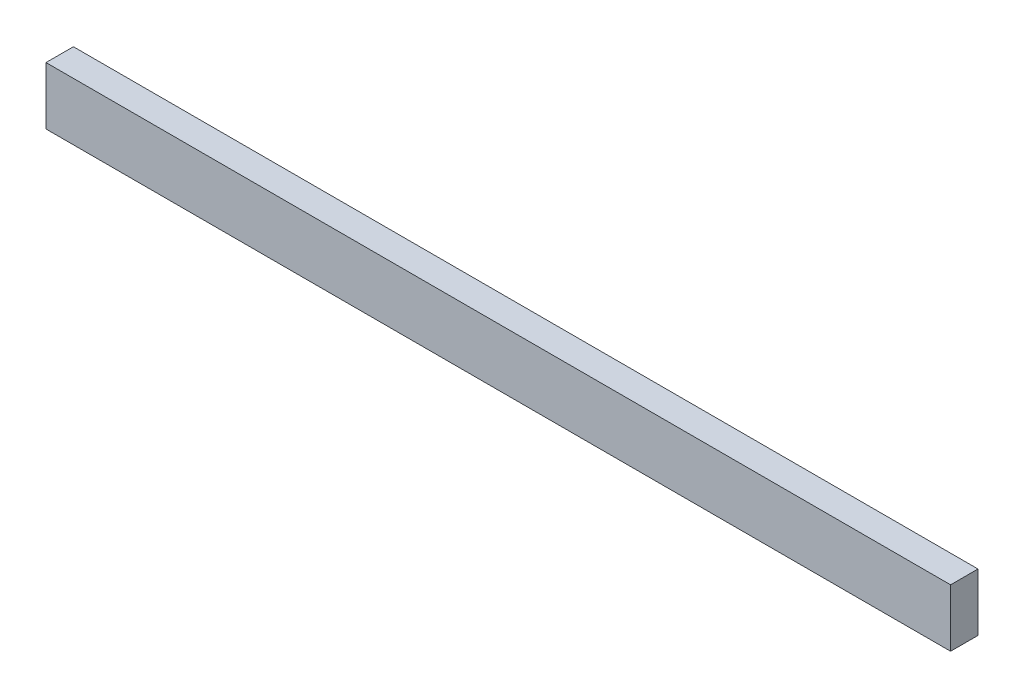
ISO-10303-21;
HEADER;
FILE_DESCRIPTION(('STEP AP214'),'2;1');
FILE_NAME('part.step','',(''),(''),'','','');
FILE_SCHEMA(('AUTOMOTIVE_DESIGN { 1 0 10303 214 1 1 1 1 }'));
ENDSEC;
DATA;
#1=APPLICATION_CONTEXT('core data for automotive mechanical design processes');
#2=APPLICATION_PROTOCOL_DEFINITION('international standard','automotive_design',2000,#1);
#3=PRODUCT_CONTEXT('',#1,'mechanical');
#4=PRODUCT('Part','Part','',(#3));
#5=PRODUCT_RELATED_PRODUCT_CATEGORY('part','',(#4));
#6=PRODUCT_DEFINITION_FORMATION('','',#4);
#7=PRODUCT_DEFINITION_CONTEXT('part definition',#1,'design');
#8=PRODUCT_DEFINITION('design','',#6,#7);
#9=PRODUCT_DEFINITION_SHAPE('','',#8);
#10=(LENGTH_UNIT() NAMED_UNIT(*) SI_UNIT(.MILLI.,.METRE.));
#11=(NAMED_UNIT(*) PLANE_ANGLE_UNIT() SI_UNIT($,.RADIAN.));
#12=(NAMED_UNIT(*) SI_UNIT($,.STERADIAN.) SOLID_ANGLE_UNIT());
#13=UNCERTAINTY_MEASURE_WITH_UNIT(LENGTH_MEASURE(1.E-05),#10,'distance_accuracy_value','');
#14=(GEOMETRIC_REPRESENTATION_CONTEXT(3) GLOBAL_UNCERTAINTY_ASSIGNED_CONTEXT((#13)) GLOBAL_UNIT_ASSIGNED_CONTEXT((#10,
#11,#12)) REPRESENTATION_CONTEXT('',''));
#15=CARTESIAN_POINT('',(0.,0.,0.));
#16=DIRECTION('',(0.,0.,1.));
#17=DIRECTION('',(1.,0.,0.));
#18=AXIS2_PLACEMENT_3D('',#15,#16,#17);
#19=CARTESIAN_POINT('',(0.,0.,1.27));
#20=DIRECTION('',(1.,0.,0.));
#21=DIRECTION('',(0.,0.,-1.));
#22=AXIS2_PLACEMENT_3D('',#19,#20,#21);
#23=PLANE('',#22);
#24=DIRECTION('',(0.,-1.,0.));
#25=VECTOR('',#24,1.);
#26=CARTESIAN_POINT('',(0.,0.,0.));
#27=LINE('',#26,#25);
#28=CARTESIAN_POINT('',(0.,2.667,0.));
#29=VERTEX_POINT('',#28);
#30=CARTESIAN_POINT('',(0.,0.,0.));
#31=VERTEX_POINT('',#30);
#32=EDGE_CURVE('E95',#29,#31,#27,.T.);
#33=ORIENTED_EDGE('',*,*,#32,.T.);
#34=DIRECTION('',(0.,0.,-1.));
#35=VECTOR('',#34,1.);
#36=CARTESIAN_POINT('',(0.,0.,1.27));
#37=LINE('',#36,#35);
#38=CARTESIAN_POINT('',(0.,0.,1.27));
#39=VERTEX_POINT('',#38);
#40=EDGE_CURVE('E11',#39,#31,#37,.T.);
#41=ORIENTED_EDGE('',*,*,#40,.F.);
#42=DIRECTION('',(0.,-1.,0.));
#43=VECTOR('',#42,1.);
#44=CARTESIAN_POINT('',(0.,0.,1.27));
#45=LINE('',#44,#43);
#46=CARTESIAN_POINT('',(0.,2.667,1.27));
#47=VERTEX_POINT('',#46);
#48=EDGE_CURVE('E83',#47,#39,#45,.T.);
#49=ORIENTED_EDGE('',*,*,#48,.F.);
#50=DIRECTION('',(0.,0.,-1.));
#51=VECTOR('',#50,1.);
#52=CARTESIAN_POINT('',(0.,2.667,1.27));
#53=LINE('',#52,#51);
#54=EDGE_CURVE('E91',#47,#29,#53,.T.);
#55=ORIENTED_EDGE('',*,*,#54,.T.);
#56=EDGE_LOOP('',(#33,#41,#49,#55));
#57=FACE_BOUND('',#56,.T.);
#58=ADVANCED_FACE('F32',(#57),#23,.F.);
#59=CARTESIAN_POINT('',(0.,0.,1.27));
#60=DIRECTION('',(0.,1.,0.));
#61=DIRECTION('',(0.,0.,1.));
#62=AXIS2_PLACEMENT_3D('',#59,#60,#61);
#63=PLANE('',#62);
#64=DIRECTION('',(1.,0.,0.));
#65=VECTOR('',#64,1.);
#66=CARTESIAN_POINT('',(0.,0.,0.));
#67=LINE('',#66,#65);
#68=CARTESIAN_POINT('',(41.91,0.,0.));
#69=VERTEX_POINT('',#68);
#70=EDGE_CURVE('E87',#31,#69,#67,.T.);
#71=ORIENTED_EDGE('',*,*,#70,.T.);
#72=DIRECTION('',(0.,0.,-1.));
#73=VECTOR('',#72,1.);
#74=CARTESIAN_POINT('',(41.91,0.,1.27));
#75=LINE('',#74,#73);
#76=CARTESIAN_POINT('',(41.91,0.,1.27));
#77=VERTEX_POINT('',#76);
#78=EDGE_CURVE('E40',#77,#69,#75,.T.);
#79=ORIENTED_EDGE('',*,*,#78,.F.);
#80=DIRECTION('',(1.,0.,0.));
#81=VECTOR('',#80,1.);
#82=CARTESIAN_POINT('',(0.,0.,1.27));
#83=LINE('',#82,#81);
#84=EDGE_CURVE('E78',#39,#77,#83,.T.);
#85=ORIENTED_EDGE('',*,*,#84,.F.);
#86=ORIENTED_EDGE('',*,*,#40,.T.);
#87=EDGE_LOOP('',(#71,#79,#85,#86));
#88=FACE_BOUND('',#87,.T.);
#89=ADVANCED_FACE('F86',(#88),#63,.F.);
#90=CARTESIAN_POINT('',(41.91,0.,1.27));
#91=DIRECTION('',(-1.,0.,0.));
#92=DIRECTION('',(0.,0.,1.));
#93=AXIS2_PLACEMENT_3D('',#90,#91,#92);
#94=PLANE('',#93);
#95=DIRECTION('',(0.,1.,0.));
#96=VECTOR('',#95,1.);
#97=CARTESIAN_POINT('',(41.91,0.,0.));
#98=LINE('',#97,#96);
#99=CARTESIAN_POINT('',(41.91,2.667,0.));
#100=VERTEX_POINT('',#99);
#101=EDGE_CURVE('E65',#69,#100,#98,.T.);
#102=ORIENTED_EDGE('',*,*,#101,.T.);
#103=DIRECTION('',(0.,0.,-1.));
#104=VECTOR('',#103,1.);
#105=CARTESIAN_POINT('',(41.91,2.667,1.27));
#106=LINE('',#105,#104);
#107=CARTESIAN_POINT('',(41.91,2.667,1.27));
#108=VERTEX_POINT('',#107);
#109=EDGE_CURVE('E88',#108,#100,#106,.T.);
#110=ORIENTED_EDGE('',*,*,#109,.F.);
#111=DIRECTION('',(0.,1.,0.));
#112=VECTOR('',#111,1.);
#113=CARTESIAN_POINT('',(41.91,0.,1.27));
#114=LINE('',#113,#112);
#115=EDGE_CURVE('E81',#77,#108,#114,.T.);
#116=ORIENTED_EDGE('',*,*,#115,.F.);
#117=ORIENTED_EDGE('',*,*,#78,.T.);
#118=EDGE_LOOP('',(#102,#110,#116,#117));
#119=FACE_BOUND('',#118,.T.);
#120=ADVANCED_FACE('F89',(#119),#94,.F.);
#121=CARTESIAN_POINT('',(0.,2.667,1.27));
#122=DIRECTION('',(0.,-1.,0.));
#123=DIRECTION('',(0.,0.,-1.));
#124=AXIS2_PLACEMENT_3D('',#121,#122,#123);
#125=PLANE('',#124);
#126=DIRECTION('',(-1.,0.,0.));
#127=VECTOR('',#126,1.);
#128=CARTESIAN_POINT('',(0.,2.667,0.));
#129=LINE('',#128,#127);
#130=EDGE_CURVE('E71',#100,#29,#129,.T.);
#131=ORIENTED_EDGE('',*,*,#130,.T.);
#132=ORIENTED_EDGE('',*,*,#54,.F.);
#133=DIRECTION('',(-1.,0.,0.));
#134=VECTOR('',#133,1.);
#135=CARTESIAN_POINT('',(0.,2.667,1.27));
#136=LINE('',#135,#134);
#137=EDGE_CURVE('E48',#108,#47,#136,.T.);
#138=ORIENTED_EDGE('',*,*,#137,.F.);
#139=ORIENTED_EDGE('',*,*,#109,.T.);
#140=EDGE_LOOP('',(#131,#132,#138,#139));
#141=FACE_BOUND('',#140,.T.);
#142=ADVANCED_FACE('F102',(#141),#125,.F.);
#143=CARTESIAN_POINT('',(0.,0.,1.27));
#144=DIRECTION('',(0.,0.,-1.));
#145=DIRECTION('',(-1.,0.,0.));
#146=AXIS2_PLACEMENT_3D('',#143,#144,#145);
#147=PLANE('',#146);
#148=ORIENTED_EDGE('',*,*,#48,.T.);
#149=ORIENTED_EDGE('',*,*,#84,.T.);
#150=ORIENTED_EDGE('',*,*,#115,.T.);
#151=ORIENTED_EDGE('',*,*,#137,.T.);
#152=EDGE_LOOP('',(#148,#149,#150,#151));
#153=FACE_BOUND('',#152,.T.);
#154=ADVANCED_FACE('F79',(#153),#147,.F.);
#155=CARTESIAN_POINT('',(0.,0.,0.));
#156=DIRECTION('',(0.,0.,-1.));
#157=DIRECTION('',(-1.,0.,0.));
#158=AXIS2_PLACEMENT_3D('',#155,#156,#157);
#159=PLANE('',#158);
#160=ORIENTED_EDGE('',*,*,#32,.F.);
#161=ORIENTED_EDGE('',*,*,#130,.F.);
#162=ORIENTED_EDGE('',*,*,#101,.F.);
#163=ORIENTED_EDGE('',*,*,#70,.F.);
#164=EDGE_LOOP('',(#160,#161,#162,#163));
#165=FACE_BOUND('',#164,.T.);
#166=ADVANCED_FACE('F105',(#165),#159,.T.);
#167=CLOSED_SHELL('',(#58,#89,#120,#142,#154,#166));
#168=MANIFOLD_SOLID_BREP('B2',#167);
#169=ADVANCED_BREP_SHAPE_REPRESENTATION('',(#18,#168),#14);
#170=SHAPE_DEFINITION_REPRESENTATION(#9,#169);
ENDSEC;
END-ISO-10303-21;
